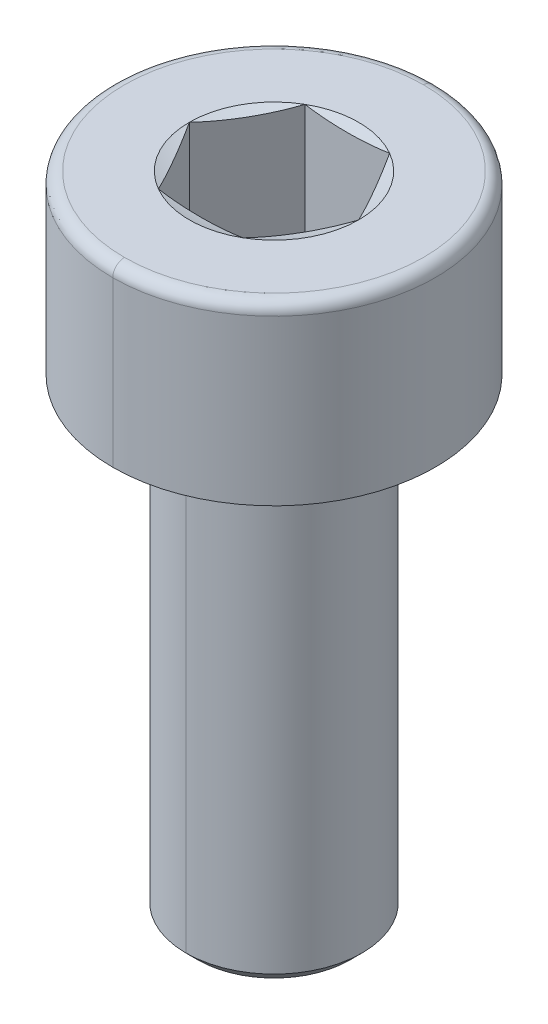
ISO-10303-21;
HEADER;
FILE_DESCRIPTION(('STEP AP214'),'2;1');
FILE_NAME('part.step','',(''),(''),'','','');
FILE_SCHEMA(('AUTOMOTIVE_DESIGN { 1 0 10303 214 1 1 1 1 }'));
ENDSEC;
DATA;
#1=APPLICATION_CONTEXT('core data for automotive mechanical design processes');
#2=APPLICATION_PROTOCOL_DEFINITION('international standard','automotive_design',2000,#1);
#3=PRODUCT_CONTEXT('',#1,'mechanical');
#4=PRODUCT('Part','Part','',(#3));
#5=PRODUCT_RELATED_PRODUCT_CATEGORY('part','',(#4));
#6=PRODUCT_DEFINITION_FORMATION('','',#4);
#7=PRODUCT_DEFINITION_CONTEXT('part definition',#1,'design');
#8=PRODUCT_DEFINITION('design','',#6,#7);
#9=PRODUCT_DEFINITION_SHAPE('','',#8);
#10=(LENGTH_UNIT() NAMED_UNIT(*) SI_UNIT(.MILLI.,.METRE.));
#11=(NAMED_UNIT(*) PLANE_ANGLE_UNIT() SI_UNIT($,.RADIAN.));
#12=(NAMED_UNIT(*) SI_UNIT($,.STERADIAN.) SOLID_ANGLE_UNIT());
#13=UNCERTAINTY_MEASURE_WITH_UNIT(LENGTH_MEASURE(1.E-05),#10,'distance_accuracy_value','');
#14=(GEOMETRIC_REPRESENTATION_CONTEXT(3) GLOBAL_UNCERTAINTY_ASSIGNED_CONTEXT((#13)) GLOBAL_UNIT_ASSIGNED_CONTEXT((#10,
#11,#12)) REPRESENTATION_CONTEXT('',''));
#15=CARTESIAN_POINT('',(0.,0.,0.));
#16=DIRECTION('',(0.,0.,1.));
#17=DIRECTION('',(1.,0.,0.));
#18=AXIS2_PLACEMENT_3D('',#15,#16,#17);
#19=CARTESIAN_POINT('',(0.,-8.,0.));
#20=DIRECTION('',(0.,1.,0.));
#21=DIRECTION('',(0.,0.,1.));
#22=AXIS2_PLACEMENT_3D('',#19,#20,#21);
#23=CONICAL_SURFACE('',#22,1.3,0.785398163397443);
#24=CARTESIAN_POINT('',(0.,-8.,0.));
#25=DIRECTION('',(0.,-1.,0.));
#26=DIRECTION('',(0.,0.,-1.));
#27=AXIS2_PLACEMENT_3D('',#24,#25,#26);
#28=CIRCLE('',#27,1.3);
#29=CARTESIAN_POINT('',(0.,-8.,-1.3));
#30=VERTEX_POINT('',#29);
#31=CARTESIAN_POINT('',(0.,-8.,1.3));
#32=VERTEX_POINT('',#31);
#33=EDGE_CURVE('E44',#30,#32,#28,.T.);
#34=ORIENTED_EDGE('',*,*,#33,.F.);
#35=DIRECTION('',(0.,0.707106781186551,-0.707106781186545));
#36=VECTOR('',#35,1.);
#37=CARTESIAN_POINT('',(0.,-8.,-1.3));
#38=LINE('',#37,#36);
#39=CARTESIAN_POINT('',(0.,-7.8,-1.5));
#40=VERTEX_POINT('',#39);
#41=EDGE_CURVE('E11',#30,#40,#38,.T.);
#42=ORIENTED_EDGE('',*,*,#41,.T.);
#43=CARTESIAN_POINT('',(0.,-7.8,0.));
#44=DIRECTION('',(0.,1.,0.));
#45=DIRECTION('',(0.,0.,-1.));
#46=AXIS2_PLACEMENT_3D('',#43,#44,#45);
#47=CIRCLE('',#46,1.5);
#48=CARTESIAN_POINT('',(0.,-7.8,1.5));
#49=VERTEX_POINT('',#48);
#50=EDGE_CURVE('E387',#49,#40,#47,.T.);
#51=ORIENTED_EDGE('',*,*,#50,.F.);
#52=DIRECTION('',(0.,0.707106781186551,0.707106781186545));
#53=VECTOR('',#52,1.);
#54=CARTESIAN_POINT('',(0.,-8.,1.3));
#55=LINE('',#54,#53);
#56=EDGE_CURVE('E183',#32,#49,#55,.T.);
#57=ORIENTED_EDGE('',*,*,#56,.F.);
#58=EDGE_LOOP('',(#34,#42,#51,#57));
#59=FACE_BOUND('',#58,.T.);
#60=ADVANCED_FACE('F16',(#59),#23,.T.);
#61=CARTESIAN_POINT('',(0.,2.8,0.));
#62=DIRECTION('',(0.,1.,0.));
#63=DIRECTION('',(0.,0.,1.));
#64=AXIS2_PLACEMENT_3D('',#61,#62,#63);
#65=TOROIDAL_SURFACE('',#64,2.55,0.2);
#66=CARTESIAN_POINT('',(0.,2.8,0.));
#67=DIRECTION('',(0.,-1.,0.));
#68=DIRECTION('',(0.,0.,1.));
#69=AXIS2_PLACEMENT_3D('',#66,#67,#68);
#70=CIRCLE('',#69,2.75);
#71=CARTESIAN_POINT('',(0.,2.8,-2.75));
#72=VERTEX_POINT('',#71);
#73=CARTESIAN_POINT('',(0.,2.8,2.75));
#74=VERTEX_POINT('',#73);
#75=EDGE_CURVE('E425',#72,#74,#70,.T.);
#76=ORIENTED_EDGE('',*,*,#75,.F.);
#77=CARTESIAN_POINT('',(0.,2.8,-2.55));
#78=DIRECTION('',(1.,0.,0.));
#79=DIRECTION('',(0.,0.,-1.));
#80=AXIS2_PLACEMENT_3D('',#77,#78,#79);
#81=CIRCLE('',#80,0.2);
#82=CARTESIAN_POINT('',(0.,3.,-2.55));
#83=VERTEX_POINT('',#82);
#84=EDGE_CURVE('E30',#72,#83,#81,.T.);
#85=ORIENTED_EDGE('',*,*,#84,.T.);
#86=CARTESIAN_POINT('',(0.,3.,0.));
#87=DIRECTION('',(0.,1.,0.));
#88=DIRECTION('',(0.,0.,1.));
#89=AXIS2_PLACEMENT_3D('',#86,#87,#88);
#90=CIRCLE('',#89,2.55);
#91=CARTESIAN_POINT('',(0.,3.,2.55));
#92=VERTEX_POINT('',#91);
#93=EDGE_CURVE('E378',#92,#83,#90,.T.);
#94=ORIENTED_EDGE('',*,*,#93,.F.);
#95=CARTESIAN_POINT('',(0.,2.8,2.55));
#96=DIRECTION('',(-1.,0.,0.));
#97=DIRECTION('',(0.,0.,1.));
#98=AXIS2_PLACEMENT_3D('',#95,#96,#97);
#99=CIRCLE('',#98,0.2);
#100=EDGE_CURVE('E392',#74,#92,#99,.T.);
#101=ORIENTED_EDGE('',*,*,#100,.F.);
#102=EDGE_LOOP('',(#76,#85,#94,#101));
#103=FACE_BOUND('',#102,.T.);
#104=ADVANCED_FACE('F470',(#103),#65,.T.);
#105=CARTESIAN_POINT('',(0.,-8.,0.));
#106=DIRECTION('',(0.,1.,0.));
#107=DIRECTION('',(0.,0.,1.));
#108=AXIS2_PLACEMENT_3D('',#105,#106,#107);
#109=CYLINDRICAL_SURFACE('',#108,1.5);
#110=ORIENTED_EDGE('',*,*,#50,.T.);
#111=DIRECTION('',(0.,1.,0.));
#112=VECTOR('',#111,1.);
#113=CARTESIAN_POINT('',(0.,-8.,-1.5));
#114=LINE('',#113,#112);
#115=CARTESIAN_POINT('',(0.,0.,-1.5));
#116=VERTEX_POINT('',#115);
#117=EDGE_CURVE('E383',#40,#116,#114,.T.);
#118=ORIENTED_EDGE('',*,*,#117,.T.);
#119=CARTESIAN_POINT('',(0.,0.,0.));
#120=DIRECTION('',(0.,-1.,0.));
#121=DIRECTION('',(0.,0.,1.));
#122=AXIS2_PLACEMENT_3D('',#119,#120,#121);
#123=CIRCLE('',#122,1.5);
#124=CARTESIAN_POINT('',(0.,0.,1.5));
#125=VERTEX_POINT('',#124);
#126=EDGE_CURVE('E388',#116,#125,#123,.T.);
#127=ORIENTED_EDGE('',*,*,#126,.T.);
#128=DIRECTION('',(0.,1.,0.));
#129=VECTOR('',#128,1.);
#130=CARTESIAN_POINT('',(0.,-8.,1.5));
#131=LINE('',#130,#129);
#132=EDGE_CURVE('E393',#49,#125,#131,.T.);
#133=ORIENTED_EDGE('',*,*,#132,.F.);
#134=EDGE_LOOP('',(#110,#118,#127,#133));
#135=FACE_BOUND('',#134,.T.);
#136=ADVANCED_FACE('F286',(#135),#109,.T.);
#137=CARTESIAN_POINT('',(0.,3.,0.));
#138=DIRECTION('',(0.,-1.,0.));
#139=DIRECTION('',(0.,0.,-1.));
#140=AXIS2_PLACEMENT_3D('',#137,#138,#139);
#141=CYLINDRICAL_SURFACE('',#140,2.75);
#142=ORIENTED_EDGE('',*,*,#75,.T.);
#143=DIRECTION('',(0.,-1.,0.));
#144=VECTOR('',#143,1.);
#145=CARTESIAN_POINT('',(0.,3.,2.75));
#146=LINE('',#145,#144);
#147=CARTESIAN_POINT('',(0.,0.,2.75));
#148=VERTEX_POINT('',#147);
#149=EDGE_CURVE('E421',#74,#148,#146,.T.);
#150=ORIENTED_EDGE('',*,*,#149,.T.);
#151=CARTESIAN_POINT('',(0.,0.,0.));
#152=DIRECTION('',(0.,1.,0.));
#153=DIRECTION('',(0.,0.,1.));
#154=AXIS2_PLACEMENT_3D('',#151,#152,#153);
#155=CIRCLE('',#154,2.75);
#156=CARTESIAN_POINT('',(0.,0.,-2.75));
#157=VERTEX_POINT('',#156);
#158=EDGE_CURVE('E426',#148,#157,#155,.T.);
#159=ORIENTED_EDGE('',*,*,#158,.T.);
#160=DIRECTION('',(0.,-1.,0.));
#161=VECTOR('',#160,1.);
#162=CARTESIAN_POINT('',(0.,3.,-2.75));
#163=LINE('',#162,#161);
#164=EDGE_CURVE('E431',#72,#157,#163,.T.);
#165=ORIENTED_EDGE('',*,*,#164,.F.);
#166=EDGE_LOOP('',(#142,#150,#159,#165));
#167=FACE_BOUND('',#166,.T.);
#168=ADVANCED_FACE('F642',(#167),#141,.T.);
#169=CARTESIAN_POINT('',(0.,0.,0.));
#170=DIRECTION('',(0.,1.,0.));
#171=DIRECTION('',(1.,0.,0.));
#172=AXIS2_PLACEMENT_3D('',#169,#170,#171);
#173=PLANE('',#172);
#174=CARTESIAN_POINT('',(0.,0.,0.));
#175=DIRECTION('',(0.,1.,0.));
#176=DIRECTION('',(0.,0.,1.));
#177=AXIS2_PLACEMENT_3D('',#174,#175,#176);
#178=CIRCLE('',#177,2.75);
#179=EDGE_CURVE('E381',#157,#148,#178,.T.);
#180=ORIENTED_EDGE('',*,*,#179,.F.);
#181=ORIENTED_EDGE('',*,*,#158,.F.);
#182=EDGE_LOOP('',(#180,#181));
#183=FACE_BOUND('',#182,.T.);
#184=CARTESIAN_POINT('',(0.,0.,0.));
#185=DIRECTION('',(0.,-1.,0.));
#186=DIRECTION('',(0.,0.,1.));
#187=AXIS2_PLACEMENT_3D('',#184,#185,#186);
#188=CIRCLE('',#187,1.5);
#189=EDGE_CURVE('E396',#125,#116,#188,.T.);
#190=ORIENTED_EDGE('',*,*,#189,.F.);
#191=ORIENTED_EDGE('',*,*,#126,.F.);
#192=EDGE_LOOP('',(#190,#191));
#193=FACE_BOUND('',#192,.T.);
#194=ADVANCED_FACE('F327',(#183,#193),#173,.F.);
#195=CARTESIAN_POINT('',(0.,3.,0.));
#196=DIRECTION('',(0.,-1.,0.));
#197=DIRECTION('',(0.,0.,-1.));
#198=AXIS2_PLACEMENT_3D('',#195,#196,#197);
#199=CYLINDRICAL_SURFACE('',#198,2.75);
#200=ORIENTED_EDGE('',*,*,#149,.F.);
#201=CARTESIAN_POINT('',(0.,2.8,0.));
#202=DIRECTION('',(0.,-1.,0.));
#203=DIRECTION('',(0.,0.,1.));
#204=AXIS2_PLACEMENT_3D('',#201,#202,#203);
#205=CIRCLE('',#204,2.75);
#206=EDGE_CURVE('E427',#74,#72,#205,.T.);
#207=ORIENTED_EDGE('',*,*,#206,.T.);
#208=ORIENTED_EDGE('',*,*,#164,.T.);
#209=ORIENTED_EDGE('',*,*,#179,.T.);
#210=EDGE_LOOP('',(#200,#207,#208,#209));
#211=FACE_BOUND('',#210,.T.);
#212=ADVANCED_FACE('F332',(#211),#199,.T.);
#213=CARTESIAN_POINT('',(0.,3.,0.));
#214=DIRECTION('',(0.,1.,0.));
#215=DIRECTION('',(1.,0.,0.));
#216=AXIS2_PLACEMENT_3D('',#213,#214,#215);
#217=PLANE('',#216);
#218=ORIENTED_EDGE('',*,*,#93,.T.);
#219=CARTESIAN_POINT('',(0.,3.,0.));
#220=DIRECTION('',(0.,1.,0.));
#221=DIRECTION('',(0.,0.,1.));
#222=AXIS2_PLACEMENT_3D('',#219,#220,#221);
#223=CIRCLE('',#222,2.55);
#224=EDGE_CURVE('E382',#83,#92,#223,.T.);
#225=ORIENTED_EDGE('',*,*,#224,.T.);
#226=EDGE_LOOP('',(#218,#225));
#227=FACE_BOUND('',#226,.T.);
#228=CARTESIAN_POINT('',(0.,3.,0.));
#229=DIRECTION('',(0.,1.,0.));
#230=DIRECTION('',(-1.,0.,0.));
#231=AXIS2_PLACEMENT_3D('',#228,#229,#230);
#232=CIRCLE('',#231,1.44337567297406);
#233=CARTESIAN_POINT('',(0.721687836487033,3.,1.25));
#234=VERTEX_POINT('',#233);
#235=CARTESIAN_POINT('',(1.44337567297406,3.,0.));
#236=VERTEX_POINT('',#235);
#237=EDGE_CURVE('E178',#234,#236,#232,.T.);
#238=ORIENTED_EDGE('',*,*,#237,.F.);
#239=CARTESIAN_POINT('',(0.,3.,0.));
#240=DIRECTION('',(0.,1.,0.));
#241=DIRECTION('',(-1.,0.,0.));
#242=AXIS2_PLACEMENT_3D('',#239,#240,#241);
#243=CIRCLE('',#242,1.44337567297406);
#244=CARTESIAN_POINT('',(-0.721687836487032,3.,1.25));
#245=VERTEX_POINT('',#244);
#246=EDGE_CURVE('E143',#245,#234,#243,.T.);
#247=ORIENTED_EDGE('',*,*,#246,.F.);
#248=CARTESIAN_POINT('',(0.,3.,0.));
#249=DIRECTION('',(0.,1.,0.));
#250=DIRECTION('',(-1.,0.,0.));
#251=AXIS2_PLACEMENT_3D('',#248,#249,#250);
#252=CIRCLE('',#251,1.44337567297406);
#253=CARTESIAN_POINT('',(-1.44337567297406,3.,0.));
#254=VERTEX_POINT('',#253);
#255=EDGE_CURVE('E175',#254,#245,#252,.T.);
#256=ORIENTED_EDGE('',*,*,#255,.F.);
#257=CARTESIAN_POINT('',(0.,3.,0.));
#258=DIRECTION('',(0.,1.,0.));
#259=DIRECTION('',(-1.,0.,0.));
#260=AXIS2_PLACEMENT_3D('',#257,#258,#259);
#261=CIRCLE('',#260,1.44337567297406);
#262=CARTESIAN_POINT('',(-0.721687836487033,3.,-1.25));
#263=VERTEX_POINT('',#262);
#264=EDGE_CURVE('E337',#263,#254,#261,.T.);
#265=ORIENTED_EDGE('',*,*,#264,.F.);
#266=CARTESIAN_POINT('',(0.,3.,0.));
#267=DIRECTION('',(0.,1.,0.));
#268=DIRECTION('',(-1.,0.,0.));
#269=AXIS2_PLACEMENT_3D('',#266,#267,#268);
#270=CIRCLE('',#269,1.44337567297406);
#271=CARTESIAN_POINT('',(0.721687836487033,3.,-1.25));
#272=VERTEX_POINT('',#271);
#273=EDGE_CURVE('E251',#272,#263,#270,.T.);
#274=ORIENTED_EDGE('',*,*,#273,.F.);
#275=CARTESIAN_POINT('',(0.,3.,0.));
#276=DIRECTION('',(0.,1.,0.));
#277=DIRECTION('',(-1.,0.,0.));
#278=AXIS2_PLACEMENT_3D('',#275,#276,#277);
#279=CIRCLE('',#278,1.44337567297406);
#280=EDGE_CURVE('E243',#236,#272,#279,.T.);
#281=ORIENTED_EDGE('',*,*,#280,.F.);
#282=EDGE_LOOP('',(#238,#247,#256,#265,#274,#281));
#283=FACE_BOUND('',#282,.T.);
#284=ADVANCED_FACE('F173',(#227,#283),#217,.T.);
#285=CARTESIAN_POINT('',(0.,-8.,0.));
#286=DIRECTION('',(0.,1.,0.));
#287=DIRECTION('',(0.,0.,1.));
#288=AXIS2_PLACEMENT_3D('',#285,#286,#287);
#289=CYLINDRICAL_SURFACE('',#288,1.5);
#290=ORIENTED_EDGE('',*,*,#117,.F.);
#291=CARTESIAN_POINT('',(0.,-7.8,0.));
#292=DIRECTION('',(0.,1.,0.));
#293=DIRECTION('',(0.,0.,-1.));
#294=AXIS2_PLACEMENT_3D('',#291,#292,#293);
#295=CIRCLE('',#294,1.5);
#296=EDGE_CURVE('E395',#40,#49,#295,.T.);
#297=ORIENTED_EDGE('',*,*,#296,.T.);
#298=ORIENTED_EDGE('',*,*,#132,.T.);
#299=ORIENTED_EDGE('',*,*,#189,.T.);
#300=EDGE_LOOP('',(#290,#297,#298,#299));
#301=FACE_BOUND('',#300,.T.);
#302=ADVANCED_FACE('F472',(#301),#289,.T.);
#303=CARTESIAN_POINT('',(0.,-8.,0.));
#304=DIRECTION('',(0.,-1.,0.));
#305=DIRECTION('',(0.,0.,-1.));
#306=AXIS2_PLACEMENT_3D('',#303,#304,#305);
#307=PLANE('',#306);
#308=CARTESIAN_POINT('',(0.,-8.,0.));
#309=DIRECTION('',(0.,-1.,0.));
#310=DIRECTION('',(0.,0.,-1.));
#311=AXIS2_PLACEMENT_3D('',#308,#309,#310);
#312=CIRCLE('',#311,1.3);
#313=EDGE_CURVE('E416',#32,#30,#312,.T.);
#314=ORIENTED_EDGE('',*,*,#313,.T.);
#315=ORIENTED_EDGE('',*,*,#33,.T.);
#316=EDGE_LOOP('',(#314,#315));
#317=FACE_BOUND('',#316,.T.);
#318=ADVANCED_FACE('F478',(#317),#307,.T.);
#319=CARTESIAN_POINT('',(0.,2.8,0.));
#320=DIRECTION('',(0.,1.,0.));
#321=DIRECTION('',(0.,0.,1.));
#322=AXIS2_PLACEMENT_3D('',#319,#320,#321);
#323=TOROIDAL_SURFACE('',#322,2.55,0.2);
#324=ORIENTED_EDGE('',*,*,#84,.F.);
#325=ORIENTED_EDGE('',*,*,#206,.F.);
#326=ORIENTED_EDGE('',*,*,#100,.T.);
#327=ORIENTED_EDGE('',*,*,#224,.F.);
#328=EDGE_LOOP('',(#324,#325,#326,#327));
#329=FACE_BOUND('',#328,.T.);
#330=ADVANCED_FACE('F467',(#329),#323,.T.);
#331=CARTESIAN_POINT('',(0.,-8.,0.));
#332=DIRECTION('',(0.,1.,0.));
#333=DIRECTION('',(0.,0.,1.));
#334=AXIS2_PLACEMENT_3D('',#331,#332,#333);
#335=CONICAL_SURFACE('',#334,1.3,0.785398163397443);
#336=ORIENTED_EDGE('',*,*,#41,.F.);
#337=ORIENTED_EDGE('',*,*,#313,.F.);
#338=ORIENTED_EDGE('',*,*,#56,.T.);
#339=ORIENTED_EDGE('',*,*,#296,.F.);
#340=EDGE_LOOP('',(#336,#337,#338,#339));
#341=FACE_BOUND('',#340,.T.);
#342=ADVANCED_FACE('F331',(#341),#335,.T.);
#343=CARTESIAN_POINT('',(0.,5.85450908693594,0.));
#344=DIRECTION('',(0.,1.,0.));
#345=DIRECTION('',(-1.,0.,0.));
#346=AXIS2_PLACEMENT_3D('',#343,#344,#345);
#347=DEGENERATE_TOROIDAL_SURFACE('',#346,0.520457544102292,3.,.T.);
#348=ORIENTED_EDGE('',*,*,#255,.T.);
#349=CARTESIAN_POINT('',(-1.44337567297406,3.,0.));
#350=CARTESIAN_POINT('',(-1.27204705234025,2.94460613535924,0.296749875728463));
#351=CARTESIAN_POINT('',(-1.08253175472901,2.94456616566707,0.625000000002667));
#352=CARTESIAN_POINT('',(-0.893263541818284,2.94452624808627,0.952822161021805));
#353=CARTESIAN_POINT('',(-0.721687836487032,3.,1.25));
#354=B_SPLINE_CURVE_WITH_KNOTS('',2,(#349,#350,#351,#352,#353),.UNSPECIFIED.,.F.,.F.,(3,2,3),
(0.,0.5,1.),.UNSPECIFIED.);
#355=EDGE_CURVE('E159',#254,#245,#354,.T.);
#356=ORIENTED_EDGE('',*,*,#355,.F.);
#357=EDGE_LOOP('',(#348,#356));
#358=FACE_BOUND('',#357,.T.);
#359=ADVANCED_FACE('F181',(#358),#347,.F.);
#360=CARTESIAN_POINT('',(0.,5.85450908693594,0.));
#361=DIRECTION('',(0.,1.,0.));
#362=DIRECTION('',(-1.,0.,0.));
#363=AXIS2_PLACEMENT_3D('',#360,#361,#362);
#364=DEGENERATE_TOROIDAL_SURFACE('',#363,0.520457544102292,3.,.T.);
#365=ORIENTED_EDGE('',*,*,#246,.T.);
#366=CARTESIAN_POINT('',(-0.721687836487032,3.,1.25));
#367=CARTESIAN_POINT('',(-0.378282590418294,2.94448521313226,1.25));
#368=CARTESIAN_POINT('',(0.00159353063771599,2.94456642031907,1.25));
#369=CARTESIAN_POINT('',(0.379284369006029,2.94464716035184,1.25));
#370=CARTESIAN_POINT('',(0.721687836487033,3.,1.25));
#371=B_SPLINE_CURVE_WITH_KNOTS('',2,(#366,#367,#368,#369,#370),.UNSPECIFIED.,.F.,.F.,(3,2,3),
(0.,0.5,1.),.UNSPECIFIED.);
#372=EDGE_CURVE('E138',#245,#234,#371,.T.);
#373=ORIENTED_EDGE('',*,*,#372,.F.);
#374=EDGE_LOOP('',(#365,#373));
#375=FACE_BOUND('',#374,.T.);
#376=ADVANCED_FACE('F141',(#375),#364,.F.);
#377=CARTESIAN_POINT('',(0.,5.85450908693594,0.));
#378=DIRECTION('',(0.,1.,0.));
#379=DIRECTION('',(-1.,0.,0.));
#380=AXIS2_PLACEMENT_3D('',#377,#378,#379);
#381=DEGENERATE_TOROIDAL_SURFACE('',#380,0.520457544102292,3.,.T.);
#382=ORIENTED_EDGE('',*,*,#237,.T.);
#383=CARTESIAN_POINT('',(0.721687836487032,3.,1.25));
#384=CARTESIAN_POINT('',(0.893016457120849,2.94460613535924,0.953250124271535));
#385=CARTESIAN_POINT('',(1.08253175473055,2.94456616566708,0.624999999999999));
#386=CARTESIAN_POINT('',(1.27179996764282,2.94452624808627,0.297177838978185));
#387=CARTESIAN_POINT('',(1.44337567297406,3.,0.));
#388=B_SPLINE_CURVE_WITH_KNOTS('',2,(#383,#384,#385,#386,#387),.UNSPECIFIED.,.F.,.F.,(3,2,3),
(0.,0.5,1.),.UNSPECIFIED.);
#389=EDGE_CURVE('E239',#234,#236,#388,.T.);
#390=ORIENTED_EDGE('',*,*,#389,.F.);
#391=EDGE_LOOP('',(#382,#390));
#392=FACE_BOUND('',#391,.T.);
#393=ADVANCED_FACE('F18',(#392),#381,.F.);
#394=CARTESIAN_POINT('',(0.,5.85450908693594,0.));
#395=DIRECTION('',(0.,1.,0.));
#396=DIRECTION('',(-1.,0.,0.));
#397=AXIS2_PLACEMENT_3D('',#394,#395,#396);
#398=DEGENERATE_TOROIDAL_SURFACE('',#397,0.520457544102292,3.,.T.);
#399=ORIENTED_EDGE('',*,*,#280,.T.);
#400=CARTESIAN_POINT('',(1.44337567297406,3.,0.));
#401=CARTESIAN_POINT('',(1.27204705234024,2.94460613535924,-0.296749875728472));
#402=CARTESIAN_POINT('',(1.08253175473055,2.94456616566708,-0.625));
#403=CARTESIAN_POINT('',(0.893263541818276,2.94452624808627,-0.95282216102182));
#404=CARTESIAN_POINT('',(0.721687836487033,3.,-1.25));
#405=B_SPLINE_CURVE_WITH_KNOTS('',2,(#400,#401,#402,#403,#404),.UNSPECIFIED.,.F.,.F.,(3,2,3),
(0.,0.5,1.),.UNSPECIFIED.);
#406=EDGE_CURVE('E258',#236,#272,#405,.T.);
#407=ORIENTED_EDGE('',*,*,#406,.F.);
#408=EDGE_LOOP('',(#399,#407));
#409=FACE_BOUND('',#408,.T.);
#410=ADVANCED_FACE('F490',(#409),#398,.F.);
#411=CARTESIAN_POINT('',(0.,5.85450908693594,0.));
#412=DIRECTION('',(0.,1.,0.));
#413=DIRECTION('',(-1.,0.,0.));
#414=AXIS2_PLACEMENT_3D('',#411,#412,#413);
#415=DEGENERATE_TOROIDAL_SURFACE('',#414,0.520457544102292,3.,.T.);
#416=ORIENTED_EDGE('',*,*,#273,.T.);
#417=CARTESIAN_POINT('',(0.721687836487033,3.,-1.25));
#418=CARTESIAN_POINT('',(0.378282590418287,2.94448521313226,-1.25));
#419=CARTESIAN_POINT('',(-0.00159353063771198,2.94456642031907,-1.25));
#420=CARTESIAN_POINT('',(-0.379284369006029,2.94464716035184,-1.25));
#421=CARTESIAN_POINT('',(-0.721687836487033,3.,-1.25));
#422=B_SPLINE_CURVE_WITH_KNOTS('',2,(#417,#418,#419,#420,#421),.UNSPECIFIED.,.F.,.F.,(3,2,3),
(0.,0.5,1.),.UNSPECIFIED.);
#423=EDGE_CURVE('E86',#272,#263,#422,.T.);
#424=ORIENTED_EDGE('',*,*,#423,.F.);
#425=EDGE_LOOP('',(#416,#424));
#426=FACE_BOUND('',#425,.T.);
#427=ADVANCED_FACE('F211',(#426),#415,.F.);
#428=CARTESIAN_POINT('',(0.,5.85450908693594,0.));
#429=DIRECTION('',(0.,1.,0.));
#430=DIRECTION('',(-1.,0.,0.));
#431=AXIS2_PLACEMENT_3D('',#428,#429,#430);
#432=DEGENERATE_TOROIDAL_SURFACE('',#431,0.520457544102292,3.,.T.);
#433=ORIENTED_EDGE('',*,*,#264,.T.);
#434=CARTESIAN_POINT('',(-0.721687836487032,3.,-1.25));
#435=CARTESIAN_POINT('',(-0.893016457119922,2.94460613535954,-0.953250124273141));
#436=CARTESIAN_POINT('',(-1.08253175473055,2.94456616566708,-0.625));
#437=CARTESIAN_POINT('',(-1.27179996764189,2.94452624808597,-0.297177838979783));
#438=CARTESIAN_POINT('',(-1.44337567297406,3.,0.));
#439=B_SPLINE_CURVE_WITH_KNOTS('',2,(#434,#435,#436,#437,#438),.UNSPECIFIED.,.F.,.F.,(3,2,3),
(0.,0.5,1.),.UNSPECIFIED.);
#440=EDGE_CURVE('E100',#263,#254,#439,.T.);
#441=ORIENTED_EDGE('',*,*,#440,.F.);
#442=EDGE_LOOP('',(#433,#441));
#443=FACE_BOUND('',#442,.T.);
#444=ADVANCED_FACE('F214',(#443),#432,.F.);
#445=CARTESIAN_POINT('',(-0.721687836487033,1.,-1.25));
#446=DIRECTION('',(0.,-1.,0.));
#447=DIRECTION('',(0.,0.,-1.));
#448=AXIS2_PLACEMENT_3D('',#445,#446,#447);
#449=PLANE('',#448);
#450=DIRECTION('',(-0.5,0.,0.866025403784439));
#451=VECTOR('',#450,1.);
#452=CARTESIAN_POINT('',(-1.44337567297406,1.,0.));
#453=LINE('',#452,#451);
#454=CARTESIAN_POINT('',(-0.721687836487033,1.,-1.25));
#455=VERTEX_POINT('',#454);
#456=CARTESIAN_POINT('',(-1.44337567297406,1.,0.));
#457=VERTEX_POINT('',#456);
#458=EDGE_CURVE('E345',#455,#457,#453,.T.);
#459=ORIENTED_EDGE('',*,*,#458,.T.);
#460=DIRECTION('',(0.5,0.,0.866025403784439));
#461=VECTOR('',#460,1.);
#462=CARTESIAN_POINT('',(-0.721687836487032,1.,1.25));
#463=LINE('',#462,#461);
#464=CARTESIAN_POINT('',(-0.721687836487032,1.,1.25));
#465=VERTEX_POINT('',#464);
#466=EDGE_CURVE('E376',#457,#465,#463,.T.);
#467=ORIENTED_EDGE('',*,*,#466,.T.);
#468=DIRECTION('',(1.,0.,0.));
#469=VECTOR('',#468,1.);
#470=CARTESIAN_POINT('',(0.721687836487032,1.,1.25));
#471=LINE('',#470,#469);
#472=CARTESIAN_POINT('',(0.721687836487032,1.,1.25));
#473=VERTEX_POINT('',#472);
#474=EDGE_CURVE('E187',#465,#473,#471,.T.);
#475=ORIENTED_EDGE('',*,*,#474,.T.);
#476=DIRECTION('',(0.5,0.,-0.866025403784438));
#477=VECTOR('',#476,1.);
#478=CARTESIAN_POINT('',(1.44337567297406,1.,0.));
#479=LINE('',#478,#477);
#480=CARTESIAN_POINT('',(1.44337567297406,1.,0.));
#481=VERTEX_POINT('',#480);
#482=EDGE_CURVE('E371',#473,#481,#479,.T.);
#483=ORIENTED_EDGE('',*,*,#482,.T.);
#484=DIRECTION('',(-0.5,0.,-0.866025403784439));
#485=VECTOR('',#484,1.);
#486=CARTESIAN_POINT('',(0.721687836487033,1.,-1.25));
#487=LINE('',#486,#485);
#488=CARTESIAN_POINT('',(0.721687836487033,1.,-1.25));
#489=VERTEX_POINT('',#488);
#490=EDGE_CURVE('E359',#481,#489,#487,.T.);
#491=ORIENTED_EDGE('',*,*,#490,.T.);
#492=DIRECTION('',(-1.,0.,0.));
#493=VECTOR('',#492,1.);
#494=CARTESIAN_POINT('',(-0.721687836487033,1.,-1.25));
#495=LINE('',#494,#493);
#496=EDGE_CURVE('E352',#489,#455,#495,.T.);
#497=ORIENTED_EDGE('',*,*,#496,.T.);
#498=EDGE_LOOP('',(#459,#467,#475,#483,#491,#497));
#499=FACE_BOUND('',#498,.T.);
#500=ADVANCED_FACE('F218',(#499),#449,.F.);
#501=CARTESIAN_POINT('',(-0.721687836487032,1.,1.25));
#502=DIRECTION('',(-0.866025403784439,0.,0.5));
#503=DIRECTION('',(0.,1.,0.));
#504=AXIS2_PLACEMENT_3D('',#501,#502,#503);
#505=PLANE('',#504);
#506=DIRECTION('',(0.,1.,0.));
#507=VECTOR('',#506,1.);
#508=CARTESIAN_POINT('',(-1.44337567297406,1.,0.));
#509=LINE('',#508,#507);
#510=EDGE_CURVE('E164',#457,#254,#509,.T.);
#511=ORIENTED_EDGE('',*,*,#510,.T.);
#512=ORIENTED_EDGE('',*,*,#355,.T.);
#513=DIRECTION('',(0.,1.,0.));
#514=VECTOR('',#513,1.);
#515=CARTESIAN_POINT('',(-0.721687836487032,1.,1.25));
#516=LINE('',#515,#514);
#517=EDGE_CURVE('E151',#465,#245,#516,.T.);
#518=ORIENTED_EDGE('',*,*,#517,.F.);
#519=ORIENTED_EDGE('',*,*,#466,.F.);
#520=EDGE_LOOP('',(#511,#512,#518,#519));
#521=FACE_BOUND('',#520,.T.);
#522=ADVANCED_FACE('F161',(#521),#505,.F.);
#523=CARTESIAN_POINT('',(0.721687836487032,1.,1.25));
#524=DIRECTION('',(0.,0.,1.));
#525=DIRECTION('',(1.,0.,0.));
#526=AXIS2_PLACEMENT_3D('',#523,#524,#525);
#527=PLANE('',#526);
#528=ORIENTED_EDGE('',*,*,#517,.T.);
#529=ORIENTED_EDGE('',*,*,#372,.T.);
#530=DIRECTION('',(0.,1.,0.));
#531=VECTOR('',#530,1.);
#532=CARTESIAN_POINT('',(0.721687836487032,1.,1.25));
#533=LINE('',#532,#531);
#534=EDGE_CURVE('E152',#473,#234,#533,.T.);
#535=ORIENTED_EDGE('',*,*,#534,.F.);
#536=ORIENTED_EDGE('',*,*,#474,.F.);
#537=EDGE_LOOP('',(#528,#529,#535,#536));
#538=FACE_BOUND('',#537,.T.);
#539=ADVANCED_FACE('F185',(#538),#527,.F.);
#540=CARTESIAN_POINT('',(1.44337567297406,1.,0.));
#541=DIRECTION('',(0.866025403784438,0.,0.5));
#542=DIRECTION('',(0.,-1.,0.));
#543=AXIS2_PLACEMENT_3D('',#540,#541,#542);
#544=PLANE('',#543);
#545=ORIENTED_EDGE('',*,*,#534,.T.);
#546=ORIENTED_EDGE('',*,*,#389,.T.);
#547=DIRECTION('',(0.,1.,0.));
#548=VECTOR('',#547,1.);
#549=CARTESIAN_POINT('',(1.44337567297406,1.,0.));
#550=LINE('',#549,#548);
#551=EDGE_CURVE('E254',#481,#236,#550,.T.);
#552=ORIENTED_EDGE('',*,*,#551,.F.);
#553=ORIENTED_EDGE('',*,*,#482,.F.);
#554=EDGE_LOOP('',(#545,#546,#552,#553));
#555=FACE_BOUND('',#554,.T.);
#556=ADVANCED_FACE('F210',(#555),#544,.F.);
#557=CARTESIAN_POINT('',(0.721687836487033,1.,-1.25));
#558=DIRECTION('',(0.866025403784439,0.,-0.5));
#559=DIRECTION('',(0.,-1.,0.));
#560=AXIS2_PLACEMENT_3D('',#557,#558,#559);
#561=PLANE('',#560);
#562=ORIENTED_EDGE('',*,*,#551,.T.);
#563=ORIENTED_EDGE('',*,*,#406,.T.);
#564=DIRECTION('',(0.,1.,0.));
#565=VECTOR('',#564,1.);
#566=CARTESIAN_POINT('',(0.721687836487033,1.,-1.25));
#567=LINE('',#566,#565);
#568=EDGE_CURVE('E507',#489,#272,#567,.T.);
#569=ORIENTED_EDGE('',*,*,#568,.F.);
#570=ORIENTED_EDGE('',*,*,#490,.F.);
#571=EDGE_LOOP('',(#562,#563,#569,#570));
#572=FACE_BOUND('',#571,.T.);
#573=ADVANCED_FACE('F222',(#572),#561,.F.);
#574=CARTESIAN_POINT('',(-0.721687836487033,1.,-1.25));
#575=DIRECTION('',(0.,0.,-1.));
#576=DIRECTION('',(0.,-1.,0.));
#577=AXIS2_PLACEMENT_3D('',#574,#575,#576);
#578=PLANE('',#577);
#579=ORIENTED_EDGE('',*,*,#568,.T.);
#580=ORIENTED_EDGE('',*,*,#423,.T.);
#581=DIRECTION('',(0.,1.,0.));
#582=VECTOR('',#581,1.);
#583=CARTESIAN_POINT('',(-0.721687836487033,1.,-1.25));
#584=LINE('',#583,#582);
#585=EDGE_CURVE('E301',#455,#263,#584,.T.);
#586=ORIENTED_EDGE('',*,*,#585,.F.);
#587=ORIENTED_EDGE('',*,*,#496,.F.);
#588=EDGE_LOOP('',(#579,#580,#586,#587));
#589=FACE_BOUND('',#588,.T.);
#590=ADVANCED_FACE('F279',(#589),#578,.F.);
#591=CARTESIAN_POINT('',(-1.44337567297406,1.,0.));
#592=DIRECTION('',(-0.866025403784439,0.,-0.5));
#593=DIRECTION('',(-0.5,0.,0.866025403784439));
#594=AXIS2_PLACEMENT_3D('',#591,#592,#593);
#595=PLANE('',#594);
#596=ORIENTED_EDGE('',*,*,#585,.T.);
#597=ORIENTED_EDGE('',*,*,#440,.T.);
#598=ORIENTED_EDGE('',*,*,#510,.F.);
#599=ORIENTED_EDGE('',*,*,#458,.F.);
#600=EDGE_LOOP('',(#596,#597,#598,#599));
#601=FACE_BOUND('',#600,.T.);
#602=ADVANCED_FACE('F281',(#601),#595,.F.);
#603=CLOSED_SHELL('',(#60,#104,#136,#168,#194,#212,#284,#302,#318,#330,#342,#359,#376,#393,#410,
#427,#444,#500,#522,#539,#556,#573,#590,#602));
#604=MANIFOLD_SOLID_BREP('B1',#603);
#605=ADVANCED_BREP_SHAPE_REPRESENTATION('',(#18,#604),#14);
#606=SHAPE_DEFINITION_REPRESENTATION(#9,#605);
ENDSEC;
END-ISO-10303-21;
